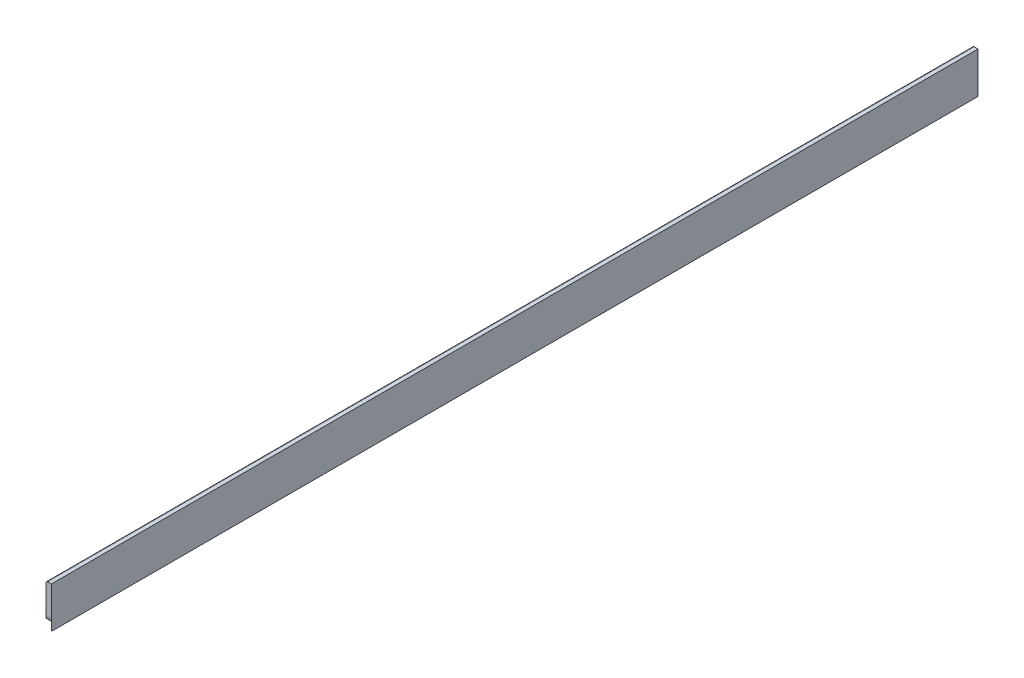
ISO-10303-21;
HEADER;
FILE_DESCRIPTION(('STEP AP214'),'2;1');
FILE_NAME('part.step','',(''),(''),'','','');
FILE_SCHEMA(('AUTOMOTIVE_DESIGN { 1 0 10303 214 1 1 1 1 }'));
ENDSEC;
DATA;
#1=APPLICATION_CONTEXT('core data for automotive mechanical design processes');
#2=APPLICATION_PROTOCOL_DEFINITION('international standard','automotive_design',2000,#1);
#3=PRODUCT_CONTEXT('',#1,'mechanical');
#4=PRODUCT('Part','Part','',(#3));
#5=PRODUCT_RELATED_PRODUCT_CATEGORY('part','',(#4));
#6=PRODUCT_DEFINITION_FORMATION('','',#4);
#7=PRODUCT_DEFINITION_CONTEXT('part definition',#1,'design');
#8=PRODUCT_DEFINITION('design','',#6,#7);
#9=PRODUCT_DEFINITION_SHAPE('','',#8);
#10=(LENGTH_UNIT() NAMED_UNIT(*) SI_UNIT(.MILLI.,.METRE.));
#11=(NAMED_UNIT(*) PLANE_ANGLE_UNIT() SI_UNIT($,.RADIAN.));
#12=(NAMED_UNIT(*) SI_UNIT($,.STERADIAN.) SOLID_ANGLE_UNIT());
#13=UNCERTAINTY_MEASURE_WITH_UNIT(LENGTH_MEASURE(1.E-05),#10,'distance_accuracy_value','');
#14=(GEOMETRIC_REPRESENTATION_CONTEXT(3) GLOBAL_UNCERTAINTY_ASSIGNED_CONTEXT((#13)) GLOBAL_UNIT_ASSIGNED_CONTEXT((#10,
#11,#12)) REPRESENTATION_CONTEXT('',''));
#15=CARTESIAN_POINT('',(0.,0.,0.));
#16=DIRECTION('',(0.,0.,1.));
#17=DIRECTION('',(1.,0.,0.));
#18=AXIS2_PLACEMENT_3D('',#15,#16,#17);
#19=CARTESIAN_POINT('',(0.,28.7,-338.));
#20=DIRECTION('',(0.,0.,-1.));
#21=DIRECTION('',(0.,1.,0.));
#22=AXIS2_PLACEMENT_3D('',#19,#20,#21);
#23=PLANE('',#22);
#24=DIRECTION('',(-1.,0.,0.));
#25=VECTOR('',#24,1.);
#26=CARTESIAN_POINT('',(-3.29597460435593E-13,30.,-338.));
#27=LINE('',#26,#25);
#28=CARTESIAN_POINT('',(-3.29597460435593E-13,30.,-338.));
#29=VERTEX_POINT('',#28);
#30=CARTESIAN_POINT('',(-2.70000000000033,30.,-338.));
#31=VERTEX_POINT('',#30);
#32=EDGE_CURVE('E260',#29,#31,#27,.T.);
#33=ORIENTED_EDGE('',*,*,#32,.F.);
#34=DIRECTION('',(0.,1.,0.));
#35=VECTOR('',#34,1.);
#36=CARTESIAN_POINT('',(0.,0.,-338.));
#37=LINE('',#36,#35);
#38=CARTESIAN_POINT('',(0.,7.99999999999997,-338.));
#39=VERTEX_POINT('',#38);
#40=EDGE_CURVE('E56',#39,#29,#37,.T.);
#41=ORIENTED_EDGE('',*,*,#40,.F.);
#42=DIRECTION('',(-1.,0.,0.));
#43=VECTOR('',#42,1.);
#44=CARTESIAN_POINT('',(0.,7.99999999999997,-338.));
#45=LINE('',#44,#43);
#46=CARTESIAN_POINT('',(-4.00000000000008,7.99999999999997,-338.));
#47=VERTEX_POINT('',#46);
#48=EDGE_CURVE('E241',#39,#47,#45,.T.);
#49=ORIENTED_EDGE('',*,*,#48,.T.);
#50=DIRECTION('',(0.,-1.,0.));
#51=VECTOR('',#50,1.);
#52=CARTESIAN_POINT('',(-4.00000000000032,28.6999999999999,-338.));
#53=LINE('',#52,#51);
#54=CARTESIAN_POINT('',(-4.00000000000032,28.7,-338.));
#55=VERTEX_POINT('',#54);
#56=EDGE_CURVE('E68',#55,#47,#53,.T.);
#57=ORIENTED_EDGE('',*,*,#56,.F.);
#58=CARTESIAN_POINT('',(-2.70000000000032,28.7,-338.));
#59=DIRECTION('',(0.,0.,-1.));
#60=DIRECTION('',(0.,1.,0.));
#61=AXIS2_PLACEMENT_3D('',#58,#59,#60);
#62=CIRCLE('',#61,1.3);
#63=EDGE_CURVE('E256',#31,#55,#62,.F.);
#64=ORIENTED_EDGE('',*,*,#63,.F.);
#65=EDGE_LOOP('',(#33,#41,#49,#57,#64));
#66=FACE_BOUND('',#65,.T.);
#67=ADVANCED_FACE('F34',(#66),#23,.T.);
#68=CARTESIAN_POINT('',(-8.00000000000009,7.99999999999989,-380.426406871193));
#69=DIRECTION('',(0.,0.,1.));
#70=DIRECTION('',(1.,0.,0.));
#71=AXIS2_PLACEMENT_3D('',#68,#69,#70);
#72=CYLINDRICAL_SURFACE('',#71,4.);
#73=DIRECTION('',(0.,0.,1.));
#74=VECTOR('',#73,1.);
#75=CARTESIAN_POINT('',(-4.00000000000009,7.99999999999994,-380.426406871193));
#76=LINE('',#75,#74);
#77=CARTESIAN_POINT('',(-4.00000000000008,7.99999999999997,338.));
#78=VERTEX_POINT('',#77);
#79=EDGE_CURVE('E254',#47,#78,#76,.T.);
#80=ORIENTED_EDGE('',*,*,#79,.F.);
#81=CARTESIAN_POINT('',(-8.00000000000009,7.99999999999993,-334.));
#82=DIRECTION('',(0.707106781186547,0.,0.707106781186547));
#83=DIRECTION('',(-0.707106781186547,0.,0.707106781186547));
#84=AXIS2_PLACEMENT_3D('',#81,#82,#83);
#85=ELLIPSE('',#84,5.65685424949238,4.);
#86=CARTESIAN_POINT('',(-8.00000000000003,3.99999999999997,-334.));
#87=VERTEX_POINT('',#86);
#88=EDGE_CURVE('E76',#47,#87,#85,.F.);
#89=ORIENTED_EDGE('',*,*,#88,.T.);
#90=DIRECTION('',(0.,0.,1.));
#91=VECTOR('',#90,1.);
#92=CARTESIAN_POINT('',(-8.00000000000009,3.99999999999994,-380.426406871193));
#93=LINE('',#92,#91);
#94=CARTESIAN_POINT('',(-8.00000000000004,3.99999999999997,-330.));
#95=VERTEX_POINT('',#94);
#96=EDGE_CURVE('E83',#87,#95,#93,.T.);
#97=ORIENTED_EDGE('',*,*,#96,.T.);
#98=DIRECTION('',(0.,0.,1.));
#99=VECTOR('',#98,1.);
#100=CARTESIAN_POINT('',(-8.00000000000004,3.99999999999989,-380.426406871193));
#101=LINE('',#100,#99);
#102=CARTESIAN_POINT('',(-8.00000000000004,3.99999999999997,330.));
#103=VERTEX_POINT('',#102);
#104=EDGE_CURVE('E268',#95,#103,#101,.T.);
#105=ORIENTED_EDGE('',*,*,#104,.T.);
#106=DIRECTION('',(0.,0.,-1.));
#107=VECTOR('',#106,1.);
#108=CARTESIAN_POINT('',(-8.00000000000009,3.99999999999994,380.426406871193));
#109=LINE('',#108,#107);
#110=CARTESIAN_POINT('',(-8.00000000000003,3.99999999999997,334.));
#111=VERTEX_POINT('',#110);
#112=EDGE_CURVE('E201',#111,#103,#109,.T.);
#113=ORIENTED_EDGE('',*,*,#112,.F.);
#114=CARTESIAN_POINT('',(-8.00000000000009,7.99999999999993,334.));
#115=DIRECTION('',(-0.707106781186547,0.,0.707106781186547));
#116=DIRECTION('',(-0.707106781186547,0.,-0.707106781186547));
#117=AXIS2_PLACEMENT_3D('',#114,#115,#116);
#118=ELLIPSE('',#117,5.65685424949238,4.);
#119=EDGE_CURVE('E204',#78,#111,#118,.F.);
#120=ORIENTED_EDGE('',*,*,#119,.F.);
#121=EDGE_LOOP('',(#80,#89,#97,#105,#113,#120));
#122=FACE_BOUND('',#121,.T.);
#123=ADVANCED_FACE('F293',(#122),#72,.F.);
#124=CARTESIAN_POINT('',(-28.7,2.69999999999967,-380.426406871193));
#125=DIRECTION('',(0.,0.,1.));
#126=DIRECTION('',(1.,0.,0.));
#127=AXIS2_PLACEMENT_3D('',#124,#125,#126);
#128=CYLINDRICAL_SURFACE('',#127,1.3);
#129=DIRECTION('',(0.,0.,1.));
#130=VECTOR('',#129,1.);
#131=CARTESIAN_POINT('',(-28.7,3.99999999999967,-380.426406871193));
#132=LINE('',#131,#130);
#133=CARTESIAN_POINT('',(-28.7,3.99999999999996,-313.3));
#134=VERTEX_POINT('',#133);
#135=CARTESIAN_POINT('',(-28.7,3.99999999999996,313.3));
#136=VERTEX_POINT('',#135);
#137=EDGE_CURVE('E266',#134,#136,#132,.T.);
#138=ORIENTED_EDGE('',*,*,#137,.F.);
#139=CARTESIAN_POINT('',(-28.7,2.69999999999982,-313.3));
#140=DIRECTION('',(0.707106781186547,0.,0.707106781186547));
#141=DIRECTION('',(-0.707106781186547,0.,0.707106781186547));
#142=AXIS2_PLACEMENT_3D('',#139,#140,#141);
#143=ELLIPSE('',#142,1.83847763108502,1.3);
#144=CARTESIAN_POINT('',(-30.,2.69999999999996,-312.));
#145=VERTEX_POINT('',#144);
#146=EDGE_CURVE('E246',#134,#145,#143,.T.);
#147=ORIENTED_EDGE('',*,*,#146,.T.);
#148=DIRECTION('',(0.,0.,1.));
#149=VECTOR('',#148,1.);
#150=CARTESIAN_POINT('',(-30.,2.69999999999965,-380.426406871193));
#151=LINE('',#150,#149);
#152=CARTESIAN_POINT('',(-30.,2.69999999999996,312.));
#153=VERTEX_POINT('',#152);
#154=EDGE_CURVE('E264',#145,#153,#151,.T.);
#155=ORIENTED_EDGE('',*,*,#154,.T.);
#156=CARTESIAN_POINT('',(-28.7,2.69999999999982,313.3));
#157=DIRECTION('',(-0.707106781186547,0.,0.707106781186547));
#158=DIRECTION('',(-0.707106781186547,0.,-0.707106781186547));
#159=AXIS2_PLACEMENT_3D('',#156,#157,#158);
#160=ELLIPSE('',#159,1.83847763108502,1.3);
#161=EDGE_CURVE('E198',#136,#153,#160,.T.);
#162=ORIENTED_EDGE('',*,*,#161,.F.);
#163=EDGE_LOOP('',(#138,#147,#155,#162));
#164=FACE_BOUND('',#163,.T.);
#165=ADVANCED_FACE('F316',(#164),#128,.T.);
#166=CARTESIAN_POINT('',(-30.,2.69999999999965,-380.426406871193));
#167=DIRECTION('',(-1.,0.,0.));
#168=DIRECTION('',(0.,-1.,0.));
#169=AXIS2_PLACEMENT_3D('',#166,#167,#168);
#170=PLANE('',#169);
#171=ORIENTED_EDGE('',*,*,#154,.F.);
#172=DIRECTION('',(0.,-1.,0.));
#173=VECTOR('',#172,1.);
#174=CARTESIAN_POINT('',(-30.,2.69999999999974,-312.));
#175=LINE('',#174,#173);
#176=CARTESIAN_POINT('',(-30.,0.,-312.));
#177=VERTEX_POINT('',#176);
#178=EDGE_CURVE('E243',#145,#177,#175,.T.);
#179=ORIENTED_EDGE('',*,*,#178,.T.);
#180=DIRECTION('',(0.,0.,1.));
#181=VECTOR('',#180,1.);
#182=CARTESIAN_POINT('',(-30.,-3.2161760154916E-13,-380.426406871193));
#183=LINE('',#182,#181);
#184=CARTESIAN_POINT('',(-30.,0.,312.));
#185=VERTEX_POINT('',#184);
#186=EDGE_CURVE('E41',#177,#185,#183,.T.);
#187=ORIENTED_EDGE('',*,*,#186,.T.);
#188=DIRECTION('',(0.,-1.,0.));
#189=VECTOR('',#188,1.);
#190=CARTESIAN_POINT('',(-30.,2.69999999999974,312.));
#191=LINE('',#190,#189);
#192=EDGE_CURVE('E171',#153,#185,#191,.T.);
#193=ORIENTED_EDGE('',*,*,#192,.F.);
#194=EDGE_LOOP('',(#171,#179,#187,#193));
#195=FACE_BOUND('',#194,.T.);
#196=ADVANCED_FACE('F334',(#195),#170,.T.);
#197=CARTESIAN_POINT('',(-30.,-3.2161760154916E-13,-380.426406871193));
#198=DIRECTION('',(0.,-1.,0.));
#199=DIRECTION('',(1.,0.,0.));
#200=AXIS2_PLACEMENT_3D('',#197,#198,#199);
#201=PLANE('',#200);
#202=ORIENTED_EDGE('',*,*,#186,.F.);
#203=DIRECTION('',(-1.,0.,0.));
#204=VECTOR('',#203,1.);
#205=CARTESIAN_POINT('',(0.,0.,-312.));
#206=LINE('',#205,#204);
#207=CARTESIAN_POINT('',(-26.,0.,-312.));
#208=VERTEX_POINT('',#207);
#209=EDGE_CURVE('E231',#208,#177,#206,.T.);
#210=ORIENTED_EDGE('',*,*,#209,.F.);
#211=DIRECTION('',(0.707106781186547,0.,-0.707106781186548));
#212=VECTOR('',#211,1.);
#213=CARTESIAN_POINT('',(0.,0.,-338.));
#214=LINE('',#213,#212);
#215=CARTESIAN_POINT('',(0.,0.,-338.));
#216=VERTEX_POINT('',#215);
#217=EDGE_CURVE('E214',#208,#216,#214,.T.);
#218=ORIENTED_EDGE('',*,*,#217,.T.);
#219=DIRECTION('',(0.,0.,1.));
#220=VECTOR('',#219,1.);
#221=CARTESIAN_POINT('',(0.,0.,-380.426406871193));
#222=LINE('',#221,#220);
#223=CARTESIAN_POINT('',(0.,0.,338.));
#224=VERTEX_POINT('',#223);
#225=EDGE_CURVE('E11',#216,#224,#222,.T.);
#226=ORIENTED_EDGE('',*,*,#225,.T.);
#227=DIRECTION('',(0.707106781186547,0.,0.707106781186548));
#228=VECTOR('',#227,1.);
#229=CARTESIAN_POINT('',(0.,0.,338.));
#230=LINE('',#229,#228);
#231=CARTESIAN_POINT('',(-26.,0.,312.));
#232=VERTEX_POINT('',#231);
#233=EDGE_CURVE('E160',#232,#224,#230,.T.);
#234=ORIENTED_EDGE('',*,*,#233,.F.);
#235=DIRECTION('',(-1.,0.,0.));
#236=VECTOR('',#235,1.);
#237=CARTESIAN_POINT('',(0.,0.,312.));
#238=LINE('',#237,#236);
#239=EDGE_CURVE('E168',#232,#185,#238,.T.);
#240=ORIENTED_EDGE('',*,*,#239,.T.);
#241=EDGE_LOOP('',(#202,#210,#218,#226,#234,#240));
#242=FACE_BOUND('',#241,.T.);
#243=ADVANCED_FACE('F177',(#242),#201,.T.);
#244=CARTESIAN_POINT('',(0.,0.,-380.426406871193));
#245=DIRECTION('',(1.,0.,0.));
#246=DIRECTION('',(0.,1.,0.));
#247=AXIS2_PLACEMENT_3D('',#244,#245,#246);
#248=PLANE('',#247);
#249=ORIENTED_EDGE('',*,*,#225,.F.);
#250=EDGE_CURVE('E48',#216,#39,#37,.T.);
#251=ORIENTED_EDGE('',*,*,#250,.T.);
#252=ORIENTED_EDGE('',*,*,#40,.T.);
#253=DIRECTION('',(0.,0.,1.));
#254=VECTOR('',#253,1.);
#255=CARTESIAN_POINT('',(-3.29597460435593E-13,30.,-380.426406871193));
#256=LINE('',#255,#254);
#257=CARTESIAN_POINT('',(-3.29597460435593E-13,30.,338.));
#258=VERTEX_POINT('',#257);
#259=EDGE_CURVE('E252',#29,#258,#256,.T.);
#260=ORIENTED_EDGE('',*,*,#259,.T.);
#261=DIRECTION('',(0.,1.,0.));
#262=VECTOR('',#261,1.);
#263=CARTESIAN_POINT('',(0.,0.,338.));
#264=LINE('',#263,#262);
#265=CARTESIAN_POINT('',(0.,7.99999999999997,338.));
#266=VERTEX_POINT('',#265);
#267=EDGE_CURVE('E207',#266,#258,#264,.T.);
#268=ORIENTED_EDGE('',*,*,#267,.F.);
#269=EDGE_CURVE('E208',#224,#266,#264,.T.);
#270=ORIENTED_EDGE('',*,*,#269,.F.);
#271=EDGE_LOOP('',(#249,#251,#252,#260,#268,#270));
#272=FACE_BOUND('',#271,.T.);
#273=ADVANCED_FACE('F275',(#272),#248,.T.);
#274=CARTESIAN_POINT('',(-3.29597460435593E-13,30.,-380.426406871193));
#275=DIRECTION('',(0.,1.,0.));
#276=DIRECTION('',(-1.,0.,0.));
#277=AXIS2_PLACEMENT_3D('',#274,#275,#276);
#278=PLANE('',#277);
#279=ORIENTED_EDGE('',*,*,#259,.F.);
#280=ORIENTED_EDGE('',*,*,#32,.T.);
#281=DIRECTION('',(0.,0.,1.));
#282=VECTOR('',#281,1.);
#283=CARTESIAN_POINT('',(-2.70000000000033,30.,-380.426406871193));
#284=LINE('',#283,#282);
#285=CARTESIAN_POINT('',(-2.70000000000033,30.,338.));
#286=VERTEX_POINT('',#285);
#287=EDGE_CURVE('E259',#31,#286,#284,.T.);
#288=ORIENTED_EDGE('',*,*,#287,.T.);
#289=DIRECTION('',(-1.,0.,0.));
#290=VECTOR('',#289,1.);
#291=CARTESIAN_POINT('',(-3.29597460435593E-13,30.,338.));
#292=LINE('',#291,#290);
#293=EDGE_CURVE('E210',#258,#286,#292,.T.);
#294=ORIENTED_EDGE('',*,*,#293,.F.);
#295=EDGE_LOOP('',(#279,#280,#288,#294));
#296=FACE_BOUND('',#295,.T.);
#297=ADVANCED_FACE('F281',(#296),#278,.T.);
#298=CARTESIAN_POINT('',(-2.70000000000032,28.7,-380.426406871193));
#299=DIRECTION('',(0.,0.,1.));
#300=DIRECTION('',(1.,0.,0.));
#301=AXIS2_PLACEMENT_3D('',#298,#299,#300);
#302=CYLINDRICAL_SURFACE('',#301,1.3);
#303=ORIENTED_EDGE('',*,*,#287,.F.);
#304=ORIENTED_EDGE('',*,*,#63,.T.);
#305=DIRECTION('',(0.,0.,1.));
#306=VECTOR('',#305,1.);
#307=CARTESIAN_POINT('',(-4.00000000000032,28.7,-380.426406871193));
#308=LINE('',#307,#306);
#309=CARTESIAN_POINT('',(-4.00000000000032,28.7,338.));
#310=VERTEX_POINT('',#309);
#311=EDGE_CURVE('E255',#55,#310,#308,.T.);
#312=ORIENTED_EDGE('',*,*,#311,.T.);
#313=CARTESIAN_POINT('',(-2.70000000000032,28.7,338.));
#314=DIRECTION('',(0.,0.,-1.));
#315=DIRECTION('',(0.,1.,0.));
#316=AXIS2_PLACEMENT_3D('',#313,#314,#315);
#317=CIRCLE('',#316,1.3);
#318=EDGE_CURVE('E215',#286,#310,#317,.F.);
#319=ORIENTED_EDGE('',*,*,#318,.F.);
#320=EDGE_LOOP('',(#303,#304,#312,#319));
#321=FACE_BOUND('',#320,.T.);
#322=ADVANCED_FACE('F285',(#321),#302,.T.);
#323=CARTESIAN_POINT('',(-4.00000000000032,28.7,-380.426406871193));
#324=DIRECTION('',(-1.,0.,0.));
#325=DIRECTION('',(0.,-1.,0.));
#326=AXIS2_PLACEMENT_3D('',#323,#324,#325);
#327=PLANE('',#326);
#328=ORIENTED_EDGE('',*,*,#311,.F.);
#329=ORIENTED_EDGE('',*,*,#56,.T.);
#330=ORIENTED_EDGE('',*,*,#79,.T.);
#331=DIRECTION('',(0.,-1.,0.));
#332=VECTOR('',#331,1.);
#333=CARTESIAN_POINT('',(-4.00000000000032,28.6999999999999,338.));
#334=LINE('',#333,#332);
#335=EDGE_CURVE('E211',#310,#78,#334,.T.);
#336=ORIENTED_EDGE('',*,*,#335,.F.);
#337=EDGE_LOOP('',(#328,#329,#330,#336));
#338=FACE_BOUND('',#337,.T.);
#339=ADVANCED_FACE('F288',(#338),#327,.T.);
#340=CARTESIAN_POINT('',(-8.00000000000004,3.99999999999989,-380.426406871193));
#341=DIRECTION('',(0.,1.,0.));
#342=DIRECTION('',(-1.,0.,0.));
#343=AXIS2_PLACEMENT_3D('',#340,#341,#342);
#344=PLANE('',#343);
#345=DIRECTION('',(-1.,0.,0.));
#346=VECTOR('',#345,1.);
#347=CARTESIAN_POINT('',(0.,3.99999999999996,-313.3));
#348=LINE('',#347,#346);
#349=CARTESIAN_POINT('',(-24.7,3.99999999999996,-313.3));
#350=VERTEX_POINT('',#349);
#351=EDGE_CURVE('E236',#350,#134,#348,.T.);
#352=ORIENTED_EDGE('',*,*,#351,.T.);
#353=ORIENTED_EDGE('',*,*,#137,.T.);
#354=DIRECTION('',(-1.,0.,0.));
#355=VECTOR('',#354,1.);
#356=CARTESIAN_POINT('',(0.,3.99999999999996,313.3));
#357=LINE('',#356,#355);
#358=CARTESIAN_POINT('',(-24.7,3.99999999999996,313.3));
#359=VERTEX_POINT('',#358);
#360=EDGE_CURVE('E189',#359,#136,#357,.T.);
#361=ORIENTED_EDGE('',*,*,#360,.F.);
#362=DIRECTION('',(0.707106781186547,0.,0.707106781186548));
#363=VECTOR('',#362,1.);
#364=CARTESIAN_POINT('',(-1.99999999999999,3.99999999999997,336.));
#365=LINE('',#364,#363);
#366=EDGE_CURVE('E184',#359,#103,#365,.T.);
#367=ORIENTED_EDGE('',*,*,#366,.T.);
#368=ORIENTED_EDGE('',*,*,#104,.F.);
#369=DIRECTION('',(0.707106781186547,0.,-0.707106781186548));
#370=VECTOR('',#369,1.);
#371=CARTESIAN_POINT('',(-1.99999999999999,3.99999999999997,-336.));
#372=LINE('',#371,#370);
#373=EDGE_CURVE('E226',#350,#95,#372,.T.);
#374=ORIENTED_EDGE('',*,*,#373,.F.);
#375=EDGE_LOOP('',(#352,#353,#361,#367,#368,#374));
#376=FACE_BOUND('',#375,.T.);
#377=ADVANCED_FACE('F326',(#376),#344,.T.);
#378=CARTESIAN_POINT('',(0.,3.99999999999997,-334.));
#379=DIRECTION('',(0.,-1.,0.));
#380=DIRECTION('',(0.,0.,-1.));
#381=AXIS2_PLACEMENT_3D('',#378,#379,#380);
#382=PLANE('',#381);
#383=DIRECTION('',(-1.,0.,0.));
#384=VECTOR('',#383,1.);
#385=CARTESIAN_POINT('',(0.,3.99999999999997,-334.));
#386=LINE('',#385,#384);
#387=CARTESIAN_POINT('',(-3.99999999999999,3.99999999999997,-334.));
#388=VERTEX_POINT('',#387);
#389=EDGE_CURVE('E239',#388,#87,#386,.T.);
#390=ORIENTED_EDGE('',*,*,#389,.F.);
#391=EDGE_CURVE('E225',#95,#388,#372,.T.);
#392=ORIENTED_EDGE('',*,*,#391,.F.);
#393=ORIENTED_EDGE('',*,*,#96,.F.);
#394=EDGE_LOOP('',(#390,#392,#393));
#395=FACE_BOUND('',#394,.T.);
#396=ADVANCED_FACE('F320',(#395),#382,.T.);
#397=CARTESIAN_POINT('',(0.,7.99999999999997,-334.));
#398=DIRECTION('',(-1.,0.,0.));
#399=DIRECTION('',(0.,0.,1.));
#400=AXIS2_PLACEMENT_3D('',#397,#398,#399);
#401=CYLINDRICAL_SURFACE('',#400,4.);
#402=ORIENTED_EDGE('',*,*,#48,.F.);
#403=CARTESIAN_POINT('',(-3.99999999999999,7.99999999999997,-334.));
#404=DIRECTION('',(-0.707106781186548,0.,-0.707106781186547));
#405=DIRECTION('',(-0.707106781186547,0.,0.707106781186548));
#406=AXIS2_PLACEMENT_3D('',#403,#404,#405);
#407=ELLIPSE('',#406,5.65685424949238,4.);
#408=EDGE_CURVE('E229',#388,#39,#407,.F.);
#409=ORIENTED_EDGE('',*,*,#408,.F.);
#410=ORIENTED_EDGE('',*,*,#389,.T.);
#411=ORIENTED_EDGE('',*,*,#88,.F.);
#412=EDGE_LOOP('',(#402,#409,#410,#411));
#413=FACE_BOUND('',#412,.T.);
#414=ADVANCED_FACE('F319',(#413),#401,.T.);
#415=CARTESIAN_POINT('',(0.,2.69999999999996,-313.3));
#416=DIRECTION('',(-1.,0.,0.));
#417=DIRECTION('',(0.,0.,1.));
#418=AXIS2_PLACEMENT_3D('',#415,#416,#417);
#419=CYLINDRICAL_SURFACE('',#418,1.3);
#420=ORIENTED_EDGE('',*,*,#351,.F.);
#421=CARTESIAN_POINT('',(-24.7,2.69999999999996,-313.3));
#422=DIRECTION('',(-0.707106781186548,0.,-0.707106781186547));
#423=DIRECTION('',(-0.707106781186547,0.,0.707106781186548));
#424=AXIS2_PLACEMENT_3D('',#421,#422,#423);
#425=ELLIPSE('',#424,1.83847763108502,1.3);
#426=CARTESIAN_POINT('',(-26.,2.69999999999997,-312.));
#427=VERTEX_POINT('',#426);
#428=EDGE_CURVE('E223',#427,#350,#425,.T.);
#429=ORIENTED_EDGE('',*,*,#428,.F.);
#430=DIRECTION('',(-1.,0.,0.));
#431=VECTOR('',#430,1.);
#432=CARTESIAN_POINT('',(0.,2.69999999999996,-312.));
#433=LINE('',#432,#431);
#434=EDGE_CURVE('E233',#427,#145,#433,.T.);
#435=ORIENTED_EDGE('',*,*,#434,.T.);
#436=ORIENTED_EDGE('',*,*,#146,.F.);
#437=EDGE_LOOP('',(#420,#429,#435,#436));
#438=FACE_BOUND('',#437,.T.);
#439=ADVANCED_FACE('F340',(#438),#419,.F.);
#440=CARTESIAN_POINT('',(0.,2.69999999999996,-312.));
#441=DIRECTION('',(0.,0.,-1.));
#442=DIRECTION('',(0.,1.,0.));
#443=AXIS2_PLACEMENT_3D('',#440,#441,#442);
#444=PLANE('',#443);
#445=ORIENTED_EDGE('',*,*,#434,.F.);
#446=DIRECTION('',(0.,-1.,0.));
#447=VECTOR('',#446,1.);
#448=CARTESIAN_POINT('',(-26.,30.,-312.));
#449=LINE('',#448,#447);
#450=EDGE_CURVE('E221',#427,#208,#449,.T.);
#451=ORIENTED_EDGE('',*,*,#450,.T.);
#452=ORIENTED_EDGE('',*,*,#209,.T.);
#453=ORIENTED_EDGE('',*,*,#178,.F.);
#454=EDGE_LOOP('',(#445,#451,#452,#453));
#455=FACE_BOUND('',#454,.T.);
#456=ADVANCED_FACE('F338',(#455),#444,.T.);
#457=CARTESIAN_POINT('',(0.,30.,-338.));
#458=DIRECTION('',(-0.707106781186548,0.,-0.707106781186547));
#459=DIRECTION('',(-0.707106781186547,0.,0.707106781186548));
#460=AXIS2_PLACEMENT_3D('',#457,#458,#459);
#461=PLANE('',#460);
#462=ORIENTED_EDGE('',*,*,#373,.T.);
#463=ORIENTED_EDGE('',*,*,#391,.T.);
#464=ORIENTED_EDGE('',*,*,#408,.T.);
#465=ORIENTED_EDGE('',*,*,#250,.F.);
#466=ORIENTED_EDGE('',*,*,#217,.F.);
#467=ORIENTED_EDGE('',*,*,#450,.F.);
#468=ORIENTED_EDGE('',*,*,#428,.T.);
#469=EDGE_LOOP('',(#462,#463,#464,#465,#466,#467,#468));
#470=FACE_BOUND('',#469,.T.);
#471=ADVANCED_FACE('F309',(#470),#461,.T.);
#472=CARTESIAN_POINT('',(0.,28.7,338.));
#473=DIRECTION('',(0.,0.,1.));
#474=DIRECTION('',(0.,1.,0.));
#475=AXIS2_PLACEMENT_3D('',#472,#473,#474);
#476=PLANE('',#475);
#477=ORIENTED_EDGE('',*,*,#293,.T.);
#478=ORIENTED_EDGE('',*,*,#318,.T.);
#479=ORIENTED_EDGE('',*,*,#335,.T.);
#480=DIRECTION('',(-1.,0.,0.));
#481=VECTOR('',#480,1.);
#482=CARTESIAN_POINT('',(0.,7.99999999999997,338.));
#483=LINE('',#482,#481);
#484=EDGE_CURVE('E194',#266,#78,#483,.T.);
#485=ORIENTED_EDGE('',*,*,#484,.F.);
#486=ORIENTED_EDGE('',*,*,#267,.T.);
#487=EDGE_LOOP('',(#477,#478,#479,#485,#486));
#488=FACE_BOUND('',#487,.T.);
#489=ADVANCED_FACE('F280',(#488),#476,.T.);
#490=CARTESIAN_POINT('',(0.,3.99999999999997,334.));
#491=DIRECTION('',(0.,-1.,0.));
#492=DIRECTION('',(0.,0.,1.));
#493=AXIS2_PLACEMENT_3D('',#490,#491,#492);
#494=PLANE('',#493);
#495=DIRECTION('',(-1.,0.,0.));
#496=VECTOR('',#495,1.);
#497=CARTESIAN_POINT('',(0.,3.99999999999997,334.));
#498=LINE('',#497,#496);
#499=CARTESIAN_POINT('',(-3.99999999999999,3.99999999999997,334.));
#500=VERTEX_POINT('',#499);
#501=EDGE_CURVE('E192',#500,#111,#498,.T.);
#502=ORIENTED_EDGE('',*,*,#501,.T.);
#503=ORIENTED_EDGE('',*,*,#112,.T.);
#504=EDGE_CURVE('E183',#103,#500,#365,.T.);
#505=ORIENTED_EDGE('',*,*,#504,.T.);
#506=EDGE_LOOP('',(#502,#503,#505));
#507=FACE_BOUND('',#506,.T.);
#508=ADVANCED_FACE('F300',(#507),#494,.T.);
#509=CARTESIAN_POINT('',(0.,7.99999999999997,334.));
#510=DIRECTION('',(-1.,0.,0.));
#511=DIRECTION('',(0.,0.,-1.));
#512=AXIS2_PLACEMENT_3D('',#509,#510,#511);
#513=CYLINDRICAL_SURFACE('',#512,4.);
#514=ORIENTED_EDGE('',*,*,#484,.T.);
#515=ORIENTED_EDGE('',*,*,#119,.T.);
#516=ORIENTED_EDGE('',*,*,#501,.F.);
#517=CARTESIAN_POINT('',(-3.99999999999999,7.99999999999997,334.));
#518=DIRECTION('',(0.707106781186548,0.,-0.707106781186547));
#519=DIRECTION('',(-0.707106781186547,0.,-0.707106781186548));
#520=AXIS2_PLACEMENT_3D('',#517,#518,#519);
#521=ELLIPSE('',#520,5.65685424949238,4.);
#522=EDGE_CURVE('E175',#500,#266,#521,.F.);
#523=ORIENTED_EDGE('',*,*,#522,.T.);
#524=EDGE_LOOP('',(#514,#515,#516,#523));
#525=FACE_BOUND('',#524,.T.);
#526=ADVANCED_FACE('F296',(#525),#513,.T.);
#527=CARTESIAN_POINT('',(0.,2.69999999999996,313.3));
#528=DIRECTION('',(-1.,0.,0.));
#529=DIRECTION('',(0.,0.,-1.));
#530=AXIS2_PLACEMENT_3D('',#527,#528,#529);
#531=CYLINDRICAL_SURFACE('',#530,1.3);
#532=ORIENTED_EDGE('',*,*,#360,.T.);
#533=ORIENTED_EDGE('',*,*,#161,.T.);
#534=DIRECTION('',(-1.,0.,0.));
#535=VECTOR('',#534,1.);
#536=CARTESIAN_POINT('',(0.,2.69999999999996,312.));
#537=LINE('',#536,#535);
#538=CARTESIAN_POINT('',(-26.,2.69999999999997,312.));
#539=VERTEX_POINT('',#538);
#540=EDGE_CURVE('E174',#539,#153,#537,.T.);
#541=ORIENTED_EDGE('',*,*,#540,.F.);
#542=CARTESIAN_POINT('',(-24.7,2.69999999999996,313.3));
#543=DIRECTION('',(0.707106781186548,0.,-0.707106781186547));
#544=DIRECTION('',(-0.707106781186547,0.,-0.707106781186548));
#545=AXIS2_PLACEMENT_3D('',#542,#543,#544);
#546=ELLIPSE('',#545,1.83847763108502,1.3);
#547=EDGE_CURVE('E161',#539,#359,#546,.T.);
#548=ORIENTED_EDGE('',*,*,#547,.T.);
#549=EDGE_LOOP('',(#532,#533,#541,#548));
#550=FACE_BOUND('',#549,.T.);
#551=ADVANCED_FACE('F307',(#550),#531,.F.);
#552=CARTESIAN_POINT('',(0.,2.69999999999996,312.));
#553=DIRECTION('',(0.,0.,1.));
#554=DIRECTION('',(0.,1.,0.));
#555=AXIS2_PLACEMENT_3D('',#552,#553,#554);
#556=PLANE('',#555);
#557=ORIENTED_EDGE('',*,*,#540,.T.);
#558=ORIENTED_EDGE('',*,*,#192,.T.);
#559=ORIENTED_EDGE('',*,*,#239,.F.);
#560=DIRECTION('',(0.,-1.,0.));
#561=VECTOR('',#560,1.);
#562=CARTESIAN_POINT('',(-26.,30.,312.));
#563=LINE('',#562,#561);
#564=EDGE_CURVE('E154',#539,#232,#563,.T.);
#565=ORIENTED_EDGE('',*,*,#564,.F.);
#566=EDGE_LOOP('',(#557,#558,#559,#565));
#567=FACE_BOUND('',#566,.T.);
#568=ADVANCED_FACE('F169',(#567),#556,.T.);
#569=CARTESIAN_POINT('',(0.,30.,338.));
#570=DIRECTION('',(-0.707106781186548,0.,0.707106781186547));
#571=DIRECTION('',(-0.707106781186547,0.,-0.707106781186548));
#572=AXIS2_PLACEMENT_3D('',#569,#570,#571);
#573=PLANE('',#572);
#574=ORIENTED_EDGE('',*,*,#366,.F.);
#575=ORIENTED_EDGE('',*,*,#547,.F.);
#576=ORIENTED_EDGE('',*,*,#564,.T.);
#577=ORIENTED_EDGE('',*,*,#233,.T.);
#578=ORIENTED_EDGE('',*,*,#269,.T.);
#579=ORIENTED_EDGE('',*,*,#522,.F.);
#580=ORIENTED_EDGE('',*,*,#504,.F.);
#581=EDGE_LOOP('',(#574,#575,#576,#577,#578,#579,#580));
#582=FACE_BOUND('',#581,.T.);
#583=ADVANCED_FACE('F157',(#582),#573,.T.);
#584=CLOSED_SHELL('',(#67,#123,#165,#196,#243,#273,#297,#322,#339,#377,#396,#414,#439,#456,#471,
#489,#508,#526,#551,#568,#583));
#585=MANIFOLD_SOLID_BREP('B2',#584);
#586=ADVANCED_BREP_SHAPE_REPRESENTATION('',(#18,#585),#14);
#587=SHAPE_DEFINITION_REPRESENTATION(#9,#586);
ENDSEC;
END-ISO-10303-21;
